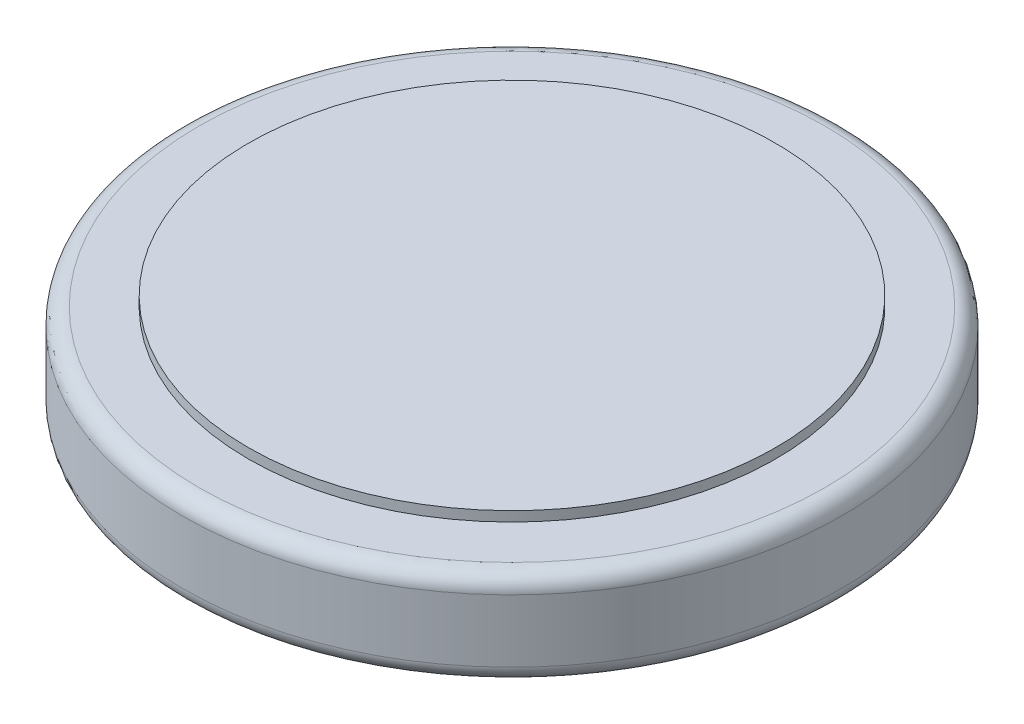
ISO-10303-21;
HEADER;
FILE_DESCRIPTION(('STEP AP214'),'2;1');
FILE_NAME('part.step','',(''),(''),'','','');
FILE_SCHEMA(('AUTOMOTIVE_DESIGN { 1 0 10303 214 1 1 1 1 }'));
ENDSEC;
DATA;
#1=APPLICATION_CONTEXT('core data for automotive mechanical design processes');
#2=APPLICATION_PROTOCOL_DEFINITION('international standard','automotive_design',2000,#1);
#3=PRODUCT_CONTEXT('',#1,'mechanical');
#4=PRODUCT('Part','Part','',(#3));
#5=PRODUCT_RELATED_PRODUCT_CATEGORY('part','',(#4));
#6=PRODUCT_DEFINITION_FORMATION('','',#4);
#7=PRODUCT_DEFINITION_CONTEXT('part definition',#1,'design');
#8=PRODUCT_DEFINITION('design','',#6,#7);
#9=PRODUCT_DEFINITION_SHAPE('','',#8);
#10=(LENGTH_UNIT() NAMED_UNIT(*) SI_UNIT(.MILLI.,.METRE.));
#11=(NAMED_UNIT(*) PLANE_ANGLE_UNIT() SI_UNIT($,.RADIAN.));
#12=(NAMED_UNIT(*) SI_UNIT($,.STERADIAN.) SOLID_ANGLE_UNIT());
#13=UNCERTAINTY_MEASURE_WITH_UNIT(LENGTH_MEASURE(1.E-05),#10,'distance_accuracy_value','');
#14=(GEOMETRIC_REPRESENTATION_CONTEXT(3) GLOBAL_UNCERTAINTY_ASSIGNED_CONTEXT((#13)) GLOBAL_UNIT_ASSIGNED_CONTEXT((#10,
#11,#12)) REPRESENTATION_CONTEXT('',''));
#15=CARTESIAN_POINT('',(0.,0.,0.));
#16=DIRECTION('',(0.,0.,1.));
#17=DIRECTION('',(1.,0.,0.));
#18=AXIS2_PLACEMENT_3D('',#15,#16,#17);
#19=CARTESIAN_POINT('',(0.,2.9,0.));
#20=DIRECTION('',(0.,-1.,0.));
#21=DIRECTION('',(0.,0.,-1.));
#22=AXIS2_PLACEMENT_3D('',#19,#20,#21);
#23=CYLINDRICAL_SURFACE('',#22,10.);
#24=CARTESIAN_POINT('',(0.,0.5,0.));
#25=DIRECTION('',(0.,1.,0.));
#26=DIRECTION('',(0.,0.,1.));
#27=AXIS2_PLACEMENT_3D('',#24,#25,#26);
#28=CIRCLE('',#27,10.);
#29=CARTESIAN_POINT('',(0.,0.5,10.));
#30=VERTEX_POINT('',#29);
#31=EDGE_CURVE('E50',#30,#30,#28,.T.);
#32=ORIENTED_EDGE('',*,*,#31,.T.);
#33=EDGE_LOOP('',(#32));
#34=FACE_BOUND('',#33,.T.);
#35=CARTESIAN_POINT('',(0.,2.4,0.));
#36=DIRECTION('',(0.,1.,0.));
#37=DIRECTION('',(0.,0.,1.));
#38=AXIS2_PLACEMENT_3D('',#35,#36,#37);
#39=CIRCLE('',#38,10.);
#40=CARTESIAN_POINT('',(0.,2.4,10.));
#41=VERTEX_POINT('',#40);
#42=EDGE_CURVE('E55',#41,#41,#39,.F.);
#43=ORIENTED_EDGE('',*,*,#42,.T.);
#44=EDGE_LOOP('',(#43));
#45=FACE_BOUND('',#44,.T.);
#46=ADVANCED_FACE('F37',(#34,#45),#23,.T.);
#47=CARTESIAN_POINT('',(0.,2.9,0.));
#48=DIRECTION('',(0.,1.,0.));
#49=DIRECTION('',(0.,0.,1.));
#50=AXIS2_PLACEMENT_3D('',#47,#48,#49);
#51=PLANE('',#50);
#52=CARTESIAN_POINT('',(0.,2.9,0.));
#53=DIRECTION('',(0.,1.,0.));
#54=DIRECTION('',(0.,0.,1.));
#55=AXIS2_PLACEMENT_3D('',#52,#53,#54);
#56=CIRCLE('',#55,9.5);
#57=CARTESIAN_POINT('',(0.,2.9,9.5));
#58=VERTEX_POINT('',#57);
#59=EDGE_CURVE('E10',#58,#58,#56,.T.);
#60=ORIENTED_EDGE('',*,*,#59,.T.);
#61=EDGE_LOOP('',(#60));
#62=FACE_BOUND('',#61,.T.);
#63=CARTESIAN_POINT('',(0.,2.9,0.));
#64=DIRECTION('',(0.,1.,0.));
#65=DIRECTION('',(0.,0.,1.));
#66=AXIS2_PLACEMENT_3D('',#63,#64,#65);
#67=CIRCLE('',#66,8.);
#68=CARTESIAN_POINT('',(0.,2.9,8.));
#69=VERTEX_POINT('',#68);
#70=EDGE_CURVE('E61',#69,#69,#67,.T.);
#71=ORIENTED_EDGE('',*,*,#70,.F.);
#72=EDGE_LOOP('',(#71));
#73=FACE_BOUND('',#72,.T.);
#74=ADVANCED_FACE('F79',(#62,#73),#51,.T.);
#75=CARTESIAN_POINT('',(0.,0.,0.));
#76=DIRECTION('',(0.,1.,0.));
#77=DIRECTION('',(0.,0.,1.));
#78=AXIS2_PLACEMENT_3D('',#75,#76,#77);
#79=PLANE('',#78);
#80=CARTESIAN_POINT('',(0.,0.,0.));
#81=DIRECTION('',(0.,1.,0.));
#82=DIRECTION('',(0.,0.,1.));
#83=AXIS2_PLACEMENT_3D('',#80,#81,#82);
#84=CIRCLE('',#83,9.5);
#85=CARTESIAN_POINT('',(0.,0.,9.5));
#86=VERTEX_POINT('',#85);
#87=EDGE_CURVE('E45',#86,#86,#84,.F.);
#88=ORIENTED_EDGE('',*,*,#87,.T.);
#89=EDGE_LOOP('',(#88));
#90=FACE_BOUND('',#89,.T.);
#91=ADVANCED_FACE('F75',(#90),#79,.F.);
#92=CARTESIAN_POINT('',(0.,3.2,0.));
#93=DIRECTION('',(0.,-1.,0.));
#94=DIRECTION('',(0.,0.,-1.));
#95=AXIS2_PLACEMENT_3D('',#92,#93,#94);
#96=CYLINDRICAL_SURFACE('',#95,8.);
#97=CARTESIAN_POINT('',(0.,3.2,0.));
#98=DIRECTION('',(0.,1.,0.));
#99=DIRECTION('',(0.,0.,1.));
#100=AXIS2_PLACEMENT_3D('',#97,#98,#99);
#101=CIRCLE('',#100,8.);
#102=CARTESIAN_POINT('',(0.,3.2,8.));
#103=VERTEX_POINT('',#102);
#104=EDGE_CURVE('E65',#103,#103,#101,.T.);
#105=ORIENTED_EDGE('',*,*,#104,.F.);
#106=EDGE_LOOP('',(#105));
#107=FACE_BOUND('',#106,.T.);
#108=ORIENTED_EDGE('',*,*,#70,.T.);
#109=EDGE_LOOP('',(#108));
#110=FACE_BOUND('',#109,.T.);
#111=ADVANCED_FACE('F72',(#107,#110),#96,.T.);
#112=CARTESIAN_POINT('',(0.,3.2,0.));
#113=DIRECTION('',(0.,1.,0.));
#114=DIRECTION('',(0.,0.,1.));
#115=AXIS2_PLACEMENT_3D('',#112,#113,#114);
#116=PLANE('',#115);
#117=ORIENTED_EDGE('',*,*,#104,.T.);
#118=EDGE_LOOP('',(#117));
#119=FACE_BOUND('',#118,.T.);
#120=ADVANCED_FACE('F70',(#119),#116,.T.);
#121=CARTESIAN_POINT('',(0.,0.5,0.));
#122=DIRECTION('',(0.,1.,0.));
#123=DIRECTION('',(0.,0.,1.));
#124=AXIS2_PLACEMENT_3D('',#121,#122,#123);
#125=TOROIDAL_SURFACE('',#124,9.5,0.5);
#126=ORIENTED_EDGE('',*,*,#87,.F.);
#127=EDGE_LOOP('',(#126));
#128=FACE_BOUND('',#127,.T.);
#129=ORIENTED_EDGE('',*,*,#31,.F.);
#130=EDGE_LOOP('',(#129));
#131=FACE_BOUND('',#130,.T.);
#132=ADVANCED_FACE('F90',(#128,#131),#125,.T.);
#133=CARTESIAN_POINT('',(0.,2.4,0.));
#134=DIRECTION('',(0.,1.,0.));
#135=DIRECTION('',(0.,0.,1.));
#136=AXIS2_PLACEMENT_3D('',#133,#134,#135);
#137=TOROIDAL_SURFACE('',#136,9.5,0.5);
#138=ORIENTED_EDGE('',*,*,#42,.F.);
#139=EDGE_LOOP('',(#138));
#140=FACE_BOUND('',#139,.T.);
#141=ORIENTED_EDGE('',*,*,#59,.F.);
#142=EDGE_LOOP('',(#141));
#143=FACE_BOUND('',#142,.T.);
#144=ADVANCED_FACE('F39',(#140,#143),#137,.T.);
#145=CLOSED_SHELL('',(#46,#74,#91,#111,#120,#132,#144));
#146=MANIFOLD_SOLID_BREP('B2',#145);
#147=ADVANCED_BREP_SHAPE_REPRESENTATION('',(#18,#146),#14);
#148=SHAPE_DEFINITION_REPRESENTATION(#9,#147);
ENDSEC;
END-ISO-10303-21;
